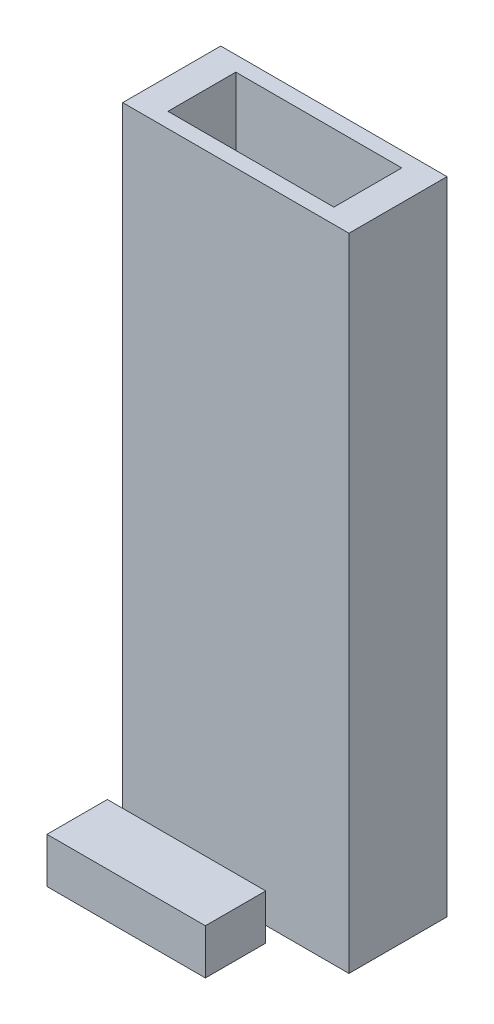
ISO-10303-21;
HEADER;
FILE_DESCRIPTION(('STEP AP214'),'2;1');
FILE_NAME('part.step','',(''),(''),'','','');
FILE_SCHEMA(('AUTOMOTIVE_DESIGN { 1 0 10303 214 1 1 1 1 }'));
ENDSEC;
DATA;
#1=APPLICATION_CONTEXT('core data for automotive mechanical design processes');
#2=APPLICATION_PROTOCOL_DEFINITION('international standard','automotive_design',2000,#1);
#3=PRODUCT_CONTEXT('',#1,'mechanical');
#4=PRODUCT('Part','Part','',(#3));
#5=PRODUCT_RELATED_PRODUCT_CATEGORY('part','',(#4));
#6=PRODUCT_DEFINITION_FORMATION('','',#4);
#7=PRODUCT_DEFINITION_CONTEXT('part definition',#1,'design');
#8=PRODUCT_DEFINITION('design','',#6,#7);
#9=PRODUCT_DEFINITION_SHAPE('','',#8);
#10=(LENGTH_UNIT() NAMED_UNIT(*) SI_UNIT(.MILLI.,.METRE.));
#11=(NAMED_UNIT(*) PLANE_ANGLE_UNIT() SI_UNIT($,.RADIAN.));
#12=(NAMED_UNIT(*) SI_UNIT($,.STERADIAN.) SOLID_ANGLE_UNIT());
#13=UNCERTAINTY_MEASURE_WITH_UNIT(LENGTH_MEASURE(1.E-05),#10,'distance_accuracy_value','');
#14=(GEOMETRIC_REPRESENTATION_CONTEXT(3) GLOBAL_UNCERTAINTY_ASSIGNED_CONTEXT((#13)) GLOBAL_UNIT_ASSIGNED_CONTEXT((#10,
#11,#12)) REPRESENTATION_CONTEXT('',''));
#15=CARTESIAN_POINT('',(0.,0.,0.));
#16=DIRECTION('',(0.,0.,1.));
#17=DIRECTION('',(1.,0.,0.));
#18=AXIS2_PLACEMENT_3D('',#15,#16,#17);
#19=CARTESIAN_POINT('',(0.,6.,15.0364351564346));
#20=DIRECTION('',(1.,0.,0.));
#21=DIRECTION('',(0.,0.,-1.));
#22=AXIS2_PLACEMENT_3D('',#19,#20,#21);
#23=PLANE('',#22);
#24=DIRECTION('',(0.,0.,1.));
#25=VECTOR('',#24,1.);
#26=CARTESIAN_POINT('',(0.,0.,15.0364351564346));
#27=LINE('',#26,#25);
#28=CARTESIAN_POINT('',(0.,0.,15.0364351564346));
#29=VERTEX_POINT('',#28);
#30=CARTESIAN_POINT('',(0.,0.,23.0364351564346));
#31=VERTEX_POINT('',#30);
#32=EDGE_CURVE('E111',#29,#31,#27,.T.);
#33=ORIENTED_EDGE('',*,*,#32,.T.);
#34=DIRECTION('',(0.,-1.,0.));
#35=VECTOR('',#34,1.);
#36=CARTESIAN_POINT('',(0.,6.,23.0364351564346));
#37=LINE('',#36,#35);
#38=CARTESIAN_POINT('',(0.,6.,23.0364351564346));
#39=VERTEX_POINT('',#38);
#40=EDGE_CURVE('E12',#39,#31,#37,.T.);
#41=ORIENTED_EDGE('',*,*,#40,.F.);
#42=DIRECTION('',(0.,0.,1.));
#43=VECTOR('',#42,1.);
#44=CARTESIAN_POINT('',(0.,6.,15.0364351564346));
#45=LINE('',#44,#43);
#46=CARTESIAN_POINT('',(0.,6.,15.0364351564346));
#47=VERTEX_POINT('',#46);
#48=EDGE_CURVE('E99',#47,#39,#45,.T.);
#49=ORIENTED_EDGE('',*,*,#48,.F.);
#50=DIRECTION('',(0.,-1.,0.));
#51=VECTOR('',#50,1.);
#52=CARTESIAN_POINT('',(0.,6.,15.0364351564346));
#53=LINE('',#52,#51);
#54=EDGE_CURVE('E107',#47,#29,#53,.T.);
#55=ORIENTED_EDGE('',*,*,#54,.T.);
#56=EDGE_LOOP('',(#33,#41,#49,#55));
#57=FACE_BOUND('',#56,.T.);
#58=ADVANCED_FACE('F48',(#57),#23,.F.);
#59=CARTESIAN_POINT('',(0.,6.,23.0364351564346));
#60=DIRECTION('',(0.,0.,-1.));
#61=DIRECTION('',(-1.,0.,0.));
#62=AXIS2_PLACEMENT_3D('',#59,#60,#61);
#63=PLANE('',#62);
#64=DIRECTION('',(1.,0.,0.));
#65=VECTOR('',#64,1.);
#66=CARTESIAN_POINT('',(0.,0.,23.0364351564346));
#67=LINE('',#66,#65);
#68=CARTESIAN_POINT('',(21.,0.,23.0364351564346));
#69=VERTEX_POINT('',#68);
#70=EDGE_CURVE('E103',#31,#69,#67,.T.);
#71=ORIENTED_EDGE('',*,*,#70,.T.);
#72=DIRECTION('',(0.,-1.,0.));
#73=VECTOR('',#72,1.);
#74=CARTESIAN_POINT('',(21.,6.,23.0364351564346));
#75=LINE('',#74,#73);
#76=CARTESIAN_POINT('',(21.,6.,23.0364351564346));
#77=VERTEX_POINT('',#76);
#78=EDGE_CURVE('E56',#77,#69,#75,.T.);
#79=ORIENTED_EDGE('',*,*,#78,.F.);
#80=DIRECTION('',(1.,0.,0.));
#81=VECTOR('',#80,1.);
#82=CARTESIAN_POINT('',(0.,6.,23.0364351564346));
#83=LINE('',#82,#81);
#84=EDGE_CURVE('E94',#39,#77,#83,.T.);
#85=ORIENTED_EDGE('',*,*,#84,.F.);
#86=ORIENTED_EDGE('',*,*,#40,.T.);
#87=EDGE_LOOP('',(#71,#79,#85,#86));
#88=FACE_BOUND('',#87,.T.);
#89=ADVANCED_FACE('F102',(#88),#63,.F.);
#90=CARTESIAN_POINT('',(21.,6.,15.0364351564346));
#91=DIRECTION('',(-1.,0.,0.));
#92=DIRECTION('',(0.,0.,1.));
#93=AXIS2_PLACEMENT_3D('',#90,#91,#92);
#94=PLANE('',#93);
#95=DIRECTION('',(0.,0.,-1.));
#96=VECTOR('',#95,1.);
#97=CARTESIAN_POINT('',(21.,0.,15.0364351564346));
#98=LINE('',#97,#96);
#99=CARTESIAN_POINT('',(21.,0.,15.0364351564346));
#100=VERTEX_POINT('',#99);
#101=EDGE_CURVE('E81',#69,#100,#98,.T.);
#102=ORIENTED_EDGE('',*,*,#101,.T.);
#103=DIRECTION('',(0.,-1.,0.));
#104=VECTOR('',#103,1.);
#105=CARTESIAN_POINT('',(21.,6.,15.0364351564346));
#106=LINE('',#105,#104);
#107=CARTESIAN_POINT('',(21.,6.,15.0364351564346));
#108=VERTEX_POINT('',#107);
#109=EDGE_CURVE('E104',#108,#100,#106,.T.);
#110=ORIENTED_EDGE('',*,*,#109,.F.);
#111=DIRECTION('',(0.,0.,-1.));
#112=VECTOR('',#111,1.);
#113=CARTESIAN_POINT('',(21.,6.,15.0364351564346));
#114=LINE('',#113,#112);
#115=EDGE_CURVE('E97',#77,#108,#114,.T.);
#116=ORIENTED_EDGE('',*,*,#115,.F.);
#117=ORIENTED_EDGE('',*,*,#78,.T.);
#118=EDGE_LOOP('',(#102,#110,#116,#117));
#119=FACE_BOUND('',#118,.T.);
#120=ADVANCED_FACE('F105',(#119),#94,.F.);
#121=CARTESIAN_POINT('',(0.,6.,15.0364351564346));
#122=DIRECTION('',(0.,0.,1.));
#123=DIRECTION('',(1.,0.,0.));
#124=AXIS2_PLACEMENT_3D('',#121,#122,#123);
#125=PLANE('',#124);
#126=DIRECTION('',(-1.,0.,0.));
#127=VECTOR('',#126,1.);
#128=CARTESIAN_POINT('',(0.,0.,15.0364351564346));
#129=LINE('',#128,#127);
#130=EDGE_CURVE('E87',#100,#29,#129,.T.);
#131=ORIENTED_EDGE('',*,*,#130,.T.);
#132=ORIENTED_EDGE('',*,*,#54,.F.);
#133=DIRECTION('',(-1.,0.,0.));
#134=VECTOR('',#133,1.);
#135=CARTESIAN_POINT('',(0.,6.,15.0364351564346));
#136=LINE('',#135,#134);
#137=EDGE_CURVE('E64',#108,#47,#136,.T.);
#138=ORIENTED_EDGE('',*,*,#137,.F.);
#139=ORIENTED_EDGE('',*,*,#109,.T.);
#140=EDGE_LOOP('',(#131,#132,#138,#139));
#141=FACE_BOUND('',#140,.T.);
#142=ADVANCED_FACE('F118',(#141),#125,.F.);
#143=CARTESIAN_POINT('',(0.,6.,0.));
#144=DIRECTION('',(0.,1.,0.));
#145=DIRECTION('',(0.,0.,1.));
#146=AXIS2_PLACEMENT_3D('',#143,#144,#145);
#147=PLANE('',#146);
#148=ORIENTED_EDGE('',*,*,#48,.T.);
#149=ORIENTED_EDGE('',*,*,#84,.T.);
#150=ORIENTED_EDGE('',*,*,#115,.T.);
#151=ORIENTED_EDGE('',*,*,#137,.T.);
#152=EDGE_LOOP('',(#148,#149,#150,#151));
#153=FACE_BOUND('',#152,.T.);
#154=ADVANCED_FACE('F95',(#153),#147,.T.);
#155=CARTESIAN_POINT('',(0.,0.,0.));
#156=DIRECTION('',(0.,1.,0.));
#157=DIRECTION('',(0.,0.,1.));
#158=AXIS2_PLACEMENT_3D('',#155,#156,#157);
#159=PLANE('',#158);
#160=ORIENTED_EDGE('',*,*,#32,.F.);
#161=ORIENTED_EDGE('',*,*,#130,.F.);
#162=ORIENTED_EDGE('',*,*,#101,.F.);
#163=ORIENTED_EDGE('',*,*,#70,.F.);
#164=EDGE_LOOP('',(#160,#161,#162,#163));
#165=FACE_BOUND('',#164,.T.);
#166=ADVANCED_FACE('F121',(#165),#159,.F.);
#167=CLOSED_SHELL('',(#58,#89,#120,#142,#154,#166));
#168=MANIFOLD_SOLID_BREP('B2',#167);
#169=CARTESIAN_POINT('',(0.,85.,0.));
#170=DIRECTION('',(1.,0.,0.));
#171=DIRECTION('',(0.,0.,-1.));
#172=AXIS2_PLACEMENT_3D('',#169,#170,#171);
#173=PLANE('',#172);
#174=DIRECTION('',(0.,0.,1.));
#175=VECTOR('',#174,1.);
#176=CARTESIAN_POINT('',(0.,0.,0.));
#177=LINE('',#176,#175);
#178=CARTESIAN_POINT('',(0.,0.,0.));
#179=VERTEX_POINT('',#178);
#180=CARTESIAN_POINT('',(0.,0.,13.));
#181=VERTEX_POINT('',#180);
#182=EDGE_CURVE('E279',#179,#181,#177,.T.);
#183=ORIENTED_EDGE('',*,*,#182,.T.);
#184=DIRECTION('',(0.,-1.,0.));
#185=VECTOR('',#184,1.);
#186=CARTESIAN_POINT('',(0.,85.,13.));
#187=LINE('',#186,#185);
#188=CARTESIAN_POINT('',(0.,85.,13.));
#189=VERTEX_POINT('',#188);
#190=EDGE_CURVE('E46',#189,#181,#187,.T.);
#191=ORIENTED_EDGE('',*,*,#190,.F.);
#192=DIRECTION('',(0.,0.,1.));
#193=VECTOR('',#192,1.);
#194=CARTESIAN_POINT('',(0.,85.,0.));
#195=LINE('',#194,#193);
#196=CARTESIAN_POINT('',(0.,85.,0.));
#197=VERTEX_POINT('',#196);
#198=EDGE_CURVE('E285',#197,#189,#195,.T.);
#199=ORIENTED_EDGE('',*,*,#198,.F.);
#200=DIRECTION('',(0.,-1.,0.));
#201=VECTOR('',#200,1.);
#202=CARTESIAN_POINT('',(0.,85.,0.));
#203=LINE('',#202,#201);
#204=EDGE_CURVE('E299',#197,#179,#203,.T.);
#205=ORIENTED_EDGE('',*,*,#204,.T.);
#206=EDGE_LOOP('',(#183,#191,#199,#205));
#207=FACE_BOUND('',#206,.T.);
#208=ADVANCED_FACE('F171',(#207),#173,.F.);
#209=CARTESIAN_POINT('',(0.,85.,13.));
#210=DIRECTION('',(0.,0.,-1.));
#211=DIRECTION('',(-1.,0.,0.));
#212=AXIS2_PLACEMENT_3D('',#209,#210,#211);
#213=PLANE('',#212);
#214=DIRECTION('',(1.,0.,0.));
#215=VECTOR('',#214,1.);
#216=CARTESIAN_POINT('',(0.,0.,13.));
#217=LINE('',#216,#215);
#218=CARTESIAN_POINT('',(30.,0.,13.));
#219=VERTEX_POINT('',#218);
#220=EDGE_CURVE('E303',#181,#219,#217,.T.);
#221=ORIENTED_EDGE('',*,*,#220,.T.);
#222=DIRECTION('',(0.,-1.,0.));
#223=VECTOR('',#222,1.);
#224=CARTESIAN_POINT('',(30.,85.,13.));
#225=LINE('',#224,#223);
#226=CARTESIAN_POINT('',(30.,85.,13.));
#227=VERTEX_POINT('',#226);
#228=EDGE_CURVE('E179',#227,#219,#225,.T.);
#229=ORIENTED_EDGE('',*,*,#228,.F.);
#230=DIRECTION('',(1.,0.,0.));
#231=VECTOR('',#230,1.);
#232=CARTESIAN_POINT('',(0.,85.,13.));
#233=LINE('',#232,#231);
#234=EDGE_CURVE('E289',#189,#227,#233,.T.);
#235=ORIENTED_EDGE('',*,*,#234,.F.);
#236=ORIENTED_EDGE('',*,*,#190,.T.);
#237=EDGE_LOOP('',(#221,#229,#235,#236));
#238=FACE_BOUND('',#237,.T.);
#239=ADVANCED_FACE('F337',(#238),#213,.F.);
#240=CARTESIAN_POINT('',(30.,85.,0.));
#241=DIRECTION('',(-1.,0.,0.));
#242=DIRECTION('',(0.,0.,1.));
#243=AXIS2_PLACEMENT_3D('',#240,#241,#242);
#244=PLANE('',#243);
#245=DIRECTION('',(0.,0.,-1.));
#246=VECTOR('',#245,1.);
#247=CARTESIAN_POINT('',(30.,0.,0.));
#248=LINE('',#247,#246);
#249=CARTESIAN_POINT('',(30.,0.,0.));
#250=VERTEX_POINT('',#249);
#251=EDGE_CURVE('E306',#219,#250,#248,.T.);
#252=ORIENTED_EDGE('',*,*,#251,.T.);
#253=DIRECTION('',(0.,-1.,0.));
#254=VECTOR('',#253,1.);
#255=CARTESIAN_POINT('',(30.,85.,0.));
#256=LINE('',#255,#254);
#257=CARTESIAN_POINT('',(30.,85.,0.));
#258=VERTEX_POINT('',#257);
#259=EDGE_CURVE('E314',#258,#250,#256,.T.);
#260=ORIENTED_EDGE('',*,*,#259,.F.);
#261=DIRECTION('',(0.,0.,-1.));
#262=VECTOR('',#261,1.);
#263=CARTESIAN_POINT('',(30.,85.,0.));
#264=LINE('',#263,#262);
#265=EDGE_CURVE('E293',#227,#258,#264,.T.);
#266=ORIENTED_EDGE('',*,*,#265,.F.);
#267=ORIENTED_EDGE('',*,*,#228,.T.);
#268=EDGE_LOOP('',(#252,#260,#266,#267));
#269=FACE_BOUND('',#268,.T.);
#270=ADVANCED_FACE('F323',(#269),#244,.F.);
#271=CARTESIAN_POINT('',(0.,85.,0.));
#272=DIRECTION('',(0.,0.,1.));
#273=DIRECTION('',(1.,0.,0.));
#274=AXIS2_PLACEMENT_3D('',#271,#272,#273);
#275=PLANE('',#274);
#276=DIRECTION('',(-1.,0.,0.));
#277=VECTOR('',#276,1.);
#278=CARTESIAN_POINT('',(0.,0.,0.));
#279=LINE('',#278,#277);
#280=EDGE_CURVE('E290',#250,#179,#279,.T.);
#281=ORIENTED_EDGE('',*,*,#280,.T.);
#282=ORIENTED_EDGE('',*,*,#204,.F.);
#283=DIRECTION('',(-1.,0.,0.));
#284=VECTOR('',#283,1.);
#285=CARTESIAN_POINT('',(0.,85.,0.));
#286=LINE('',#285,#284);
#287=EDGE_CURVE('E296',#258,#197,#286,.T.);
#288=ORIENTED_EDGE('',*,*,#287,.F.);
#289=ORIENTED_EDGE('',*,*,#259,.T.);
#290=EDGE_LOOP('',(#281,#282,#288,#289));
#291=FACE_BOUND('',#290,.T.);
#292=ADVANCED_FACE('F330',(#291),#275,.F.);
#293=CARTESIAN_POINT('',(0.,85.,0.));
#294=DIRECTION('',(0.,1.,0.));
#295=DIRECTION('',(0.,0.,1.));
#296=AXIS2_PLACEMENT_3D('',#293,#294,#295);
#297=PLANE('',#296);
#298=DIRECTION('',(0.,0.,-1.));
#299=VECTOR('',#298,1.);
#300=CARTESIAN_POINT('',(26.,85.,11.));
#301=LINE('',#300,#299);
#302=CARTESIAN_POINT('',(26.,85.,11.));
#303=VERTEX_POINT('',#302);
#304=CARTESIAN_POINT('',(26.,85.,2.));
#305=VERTEX_POINT('',#304);
#306=EDGE_CURVE('E186',#303,#305,#301,.T.);
#307=ORIENTED_EDGE('',*,*,#306,.F.);
#308=DIRECTION('',(1.,0.,0.));
#309=VECTOR('',#308,1.);
#310=CARTESIAN_POINT('',(4.,85.,11.));
#311=LINE('',#310,#309);
#312=CARTESIAN_POINT('',(4.,85.,11.));
#313=VERTEX_POINT('',#312);
#314=EDGE_CURVE('E257',#313,#303,#311,.T.);
#315=ORIENTED_EDGE('',*,*,#314,.F.);
#316=DIRECTION('',(0.,0.,1.));
#317=VECTOR('',#316,1.);
#318=CARTESIAN_POINT('',(4.,85.,11.));
#319=LINE('',#318,#317);
#320=CARTESIAN_POINT('',(4.,85.,2.));
#321=VERTEX_POINT('',#320);
#322=EDGE_CURVE('E261',#321,#313,#319,.T.);
#323=ORIENTED_EDGE('',*,*,#322,.F.);
#324=DIRECTION('',(-1.,0.,0.));
#325=VECTOR('',#324,1.);
#326=CARTESIAN_POINT('',(4.,85.,2.));
#327=LINE('',#326,#325);
#328=EDGE_CURVE('E270',#305,#321,#327,.T.);
#329=ORIENTED_EDGE('',*,*,#328,.F.);
#330=EDGE_LOOP('',(#307,#315,#323,#329));
#331=FACE_BOUND('',#330,.T.);
#332=ORIENTED_EDGE('',*,*,#198,.T.);
#333=ORIENTED_EDGE('',*,*,#234,.T.);
#334=ORIENTED_EDGE('',*,*,#265,.T.);
#335=ORIENTED_EDGE('',*,*,#287,.T.);
#336=EDGE_LOOP('',(#332,#333,#334,#335));
#337=FACE_BOUND('',#336,.T.);
#338=ADVANCED_FACE('F336',(#331,#337),#297,.T.);
#339=CARTESIAN_POINT('',(0.,0.,0.));
#340=DIRECTION('',(0.,1.,0.));
#341=DIRECTION('',(0.,0.,1.));
#342=AXIS2_PLACEMENT_3D('',#339,#340,#341);
#343=PLANE('',#342);
#344=DIRECTION('',(1.,0.,0.));
#345=VECTOR('',#344,1.);
#346=CARTESIAN_POINT('',(4.,0.,11.));
#347=LINE('',#346,#345);
#348=CARTESIAN_POINT('',(4.,0.,11.));
#349=VERTEX_POINT('',#348);
#350=CARTESIAN_POINT('',(26.,0.,11.));
#351=VERTEX_POINT('',#350);
#352=EDGE_CURVE('E245',#349,#351,#347,.T.);
#353=ORIENTED_EDGE('',*,*,#352,.T.);
#354=DIRECTION('',(0.,0.,-1.));
#355=VECTOR('',#354,1.);
#356=CARTESIAN_POINT('',(26.,0.,11.));
#357=LINE('',#356,#355);
#358=CARTESIAN_POINT('',(26.,0.,2.));
#359=VERTEX_POINT('',#358);
#360=EDGE_CURVE('E238',#351,#359,#357,.T.);
#361=ORIENTED_EDGE('',*,*,#360,.T.);
#362=DIRECTION('',(-1.,0.,0.));
#363=VECTOR('',#362,1.);
#364=CARTESIAN_POINT('',(4.,0.,2.));
#365=LINE('',#364,#363);
#366=CARTESIAN_POINT('',(4.,0.,2.));
#367=VERTEX_POINT('',#366);
#368=EDGE_CURVE('E248',#359,#367,#365,.T.);
#369=ORIENTED_EDGE('',*,*,#368,.T.);
#370=DIRECTION('',(0.,0.,1.));
#371=VECTOR('',#370,1.);
#372=CARTESIAN_POINT('',(4.,0.,11.));
#373=LINE('',#372,#371);
#374=EDGE_CURVE('E194',#367,#349,#373,.T.);
#375=ORIENTED_EDGE('',*,*,#374,.T.);
#376=EDGE_LOOP('',(#353,#361,#369,#375));
#377=FACE_BOUND('',#376,.T.);
#378=ORIENTED_EDGE('',*,*,#182,.F.);
#379=ORIENTED_EDGE('',*,*,#280,.F.);
#380=ORIENTED_EDGE('',*,*,#251,.F.);
#381=ORIENTED_EDGE('',*,*,#220,.F.);
#382=EDGE_LOOP('',(#378,#379,#380,#381));
#383=FACE_BOUND('',#382,.T.);
#384=ADVANCED_FACE('F253',(#377,#383),#343,.F.);
#385=CARTESIAN_POINT('',(26.,0.,11.));
#386=DIRECTION('',(1.,0.,0.));
#387=DIRECTION('',(0.,0.,-1.));
#388=AXIS2_PLACEMENT_3D('',#385,#386,#387);
#389=PLANE('',#388);
#390=ORIENTED_EDGE('',*,*,#306,.T.);
#391=DIRECTION('',(0.,1.,0.));
#392=VECTOR('',#391,1.);
#393=CARTESIAN_POINT('',(26.,0.,2.));
#394=LINE('',#393,#392);
#395=EDGE_CURVE('E234',#359,#305,#394,.T.);
#396=ORIENTED_EDGE('',*,*,#395,.F.);
#397=ORIENTED_EDGE('',*,*,#360,.F.);
#398=DIRECTION('',(0.,1.,0.));
#399=VECTOR('',#398,1.);
#400=CARTESIAN_POINT('',(26.,0.,11.));
#401=LINE('',#400,#399);
#402=EDGE_CURVE('E276',#351,#303,#401,.T.);
#403=ORIENTED_EDGE('',*,*,#402,.T.);
#404=EDGE_LOOP('',(#390,#396,#397,#403));
#405=FACE_BOUND('',#404,.T.);
#406=ADVANCED_FACE('F236',(#405),#389,.F.);
#407=CARTESIAN_POINT('',(4.,0.,11.));
#408=DIRECTION('',(0.,0.,1.));
#409=DIRECTION('',(1.,0.,0.));
#410=AXIS2_PLACEMENT_3D('',#407,#408,#409);
#411=PLANE('',#410);
#412=ORIENTED_EDGE('',*,*,#314,.T.);
#413=ORIENTED_EDGE('',*,*,#402,.F.);
#414=ORIENTED_EDGE('',*,*,#352,.F.);
#415=DIRECTION('',(0.,1.,0.));
#416=VECTOR('',#415,1.);
#417=CARTESIAN_POINT('',(4.,0.,11.));
#418=LINE('',#417,#416);
#419=EDGE_CURVE('E280',#349,#313,#418,.T.);
#420=ORIENTED_EDGE('',*,*,#419,.T.);
#421=EDGE_LOOP('',(#412,#413,#414,#420));
#422=FACE_BOUND('',#421,.T.);
#423=ADVANCED_FACE('F354',(#422),#411,.F.);
#424=CARTESIAN_POINT('',(4.,0.,11.));
#425=DIRECTION('',(-1.,0.,0.));
#426=DIRECTION('',(0.,0.,1.));
#427=AXIS2_PLACEMENT_3D('',#424,#425,#426);
#428=PLANE('',#427);
#429=ORIENTED_EDGE('',*,*,#322,.T.);
#430=ORIENTED_EDGE('',*,*,#419,.F.);
#431=ORIENTED_EDGE('',*,*,#374,.F.);
#432=DIRECTION('',(0.,1.,0.));
#433=VECTOR('',#432,1.);
#434=CARTESIAN_POINT('',(4.,0.,2.));
#435=LINE('',#434,#433);
#436=EDGE_CURVE('E244',#367,#321,#435,.T.);
#437=ORIENTED_EDGE('',*,*,#436,.T.);
#438=EDGE_LOOP('',(#429,#430,#431,#437));
#439=FACE_BOUND('',#438,.T.);
#440=ADVANCED_FACE('F357',(#439),#428,.F.);
#441=CARTESIAN_POINT('',(4.,0.,2.));
#442=DIRECTION('',(0.,0.,-1.));
#443=DIRECTION('',(-1.,0.,0.));
#444=AXIS2_PLACEMENT_3D('',#441,#442,#443);
#445=PLANE('',#444);
#446=ORIENTED_EDGE('',*,*,#328,.T.);
#447=ORIENTED_EDGE('',*,*,#436,.F.);
#448=ORIENTED_EDGE('',*,*,#368,.F.);
#449=ORIENTED_EDGE('',*,*,#395,.T.);
#450=EDGE_LOOP('',(#446,#447,#448,#449));
#451=FACE_BOUND('',#450,.T.);
#452=ADVANCED_FACE('F249',(#451),#445,.F.);
#453=CLOSED_SHELL('',(#208,#239,#270,#292,#338,#384,#406,#423,#440,#452));
#454=MANIFOLD_SOLID_BREP('B6',#453);
#455=ADVANCED_BREP_SHAPE_REPRESENTATION('',(#18,#168,#454),#14);
#456=SHAPE_DEFINITION_REPRESENTATION(#9,#455);
ENDSEC;
END-ISO-10303-21;
